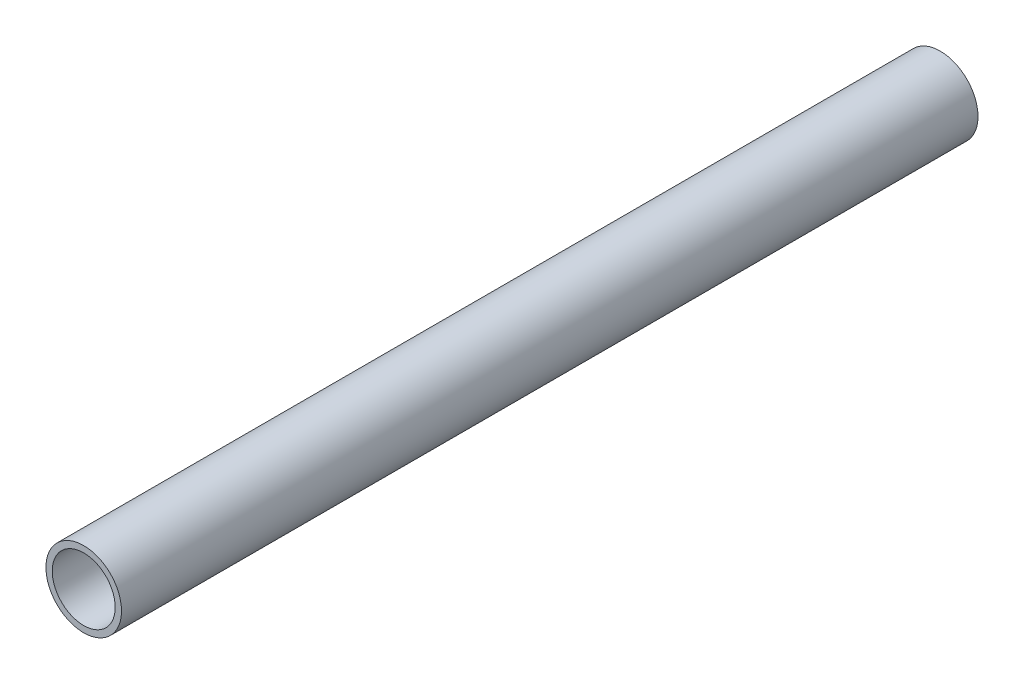
ISO-10303-21;
HEADER;
FILE_DESCRIPTION(('STEP AP214'),'2;1');
FILE_NAME('part.step','',(''),(''),'','','');
FILE_SCHEMA(('AUTOMOTIVE_DESIGN { 1 0 10303 214 1 1 1 1 }'));
ENDSEC;
DATA;
#1=APPLICATION_CONTEXT('core data for automotive mechanical design processes');
#2=APPLICATION_PROTOCOL_DEFINITION('international standard','automotive_design',2000,#1);
#3=PRODUCT_CONTEXT('',#1,'mechanical');
#4=PRODUCT('Part','Part','',(#3));
#5=PRODUCT_RELATED_PRODUCT_CATEGORY('part','',(#4));
#6=PRODUCT_DEFINITION_FORMATION('','',#4);
#7=PRODUCT_DEFINITION_CONTEXT('part definition',#1,'design');
#8=PRODUCT_DEFINITION('design','',#6,#7);
#9=PRODUCT_DEFINITION_SHAPE('','',#8);
#10=(LENGTH_UNIT() NAMED_UNIT(*) SI_UNIT(.MILLI.,.METRE.));
#11=(NAMED_UNIT(*) PLANE_ANGLE_UNIT() SI_UNIT($,.RADIAN.));
#12=(NAMED_UNIT(*) SI_UNIT($,.STERADIAN.) SOLID_ANGLE_UNIT());
#13=UNCERTAINTY_MEASURE_WITH_UNIT(LENGTH_MEASURE(1.E-05),#10,'distance_accuracy_value','');
#14=(GEOMETRIC_REPRESENTATION_CONTEXT(3) GLOBAL_UNCERTAINTY_ASSIGNED_CONTEXT((#13)) GLOBAL_UNIT_ASSIGNED_CONTEXT((#10,
#11,#12)) REPRESENTATION_CONTEXT('',''));
#15=CARTESIAN_POINT('',(0.,0.,0.));
#16=DIRECTION('',(0.,0.,1.));
#17=DIRECTION('',(1.,0.,0.));
#18=AXIS2_PLACEMENT_3D('',#15,#16,#17);
#19=CARTESIAN_POINT('',(0.,0.,0.));
#20=DIRECTION('',(0.,0.,1.));
#21=DIRECTION('',(1.,0.,0.));
#22=AXIS2_PLACEMENT_3D('',#19,#20,#21);
#23=CYLINDRICAL_SURFACE('',#22,5.);
#24=CARTESIAN_POINT('',(0.,0.,136.));
#25=DIRECTION('',(0.,0.,1.));
#26=DIRECTION('',(1.,0.,0.));
#27=AXIS2_PLACEMENT_3D('',#24,#25,#26);
#28=CIRCLE('',#27,5.);
#29=CARTESIAN_POINT('',(5.,0.,136.));
#30=VERTEX_POINT('',#29);
#31=EDGE_CURVE('E18',#30,#30,#28,.T.);
#32=ORIENTED_EDGE('',*,*,#31,.T.);
#33=EDGE_LOOP('',(#32));
#34=FACE_BOUND('',#33,.T.);
#35=CARTESIAN_POINT('',(0.,0.,0.));
#36=DIRECTION('',(0.,0.,1.));
#37=DIRECTION('',(1.,0.,0.));
#38=AXIS2_PLACEMENT_3D('',#35,#36,#37);
#39=CIRCLE('',#38,5.);
#40=CARTESIAN_POINT('',(5.,0.,0.));
#41=VERTEX_POINT('',#40);
#42=EDGE_CURVE('E10',#41,#41,#39,.T.);
#43=ORIENTED_EDGE('',*,*,#42,.F.);
#44=EDGE_LOOP('',(#43));
#45=FACE_BOUND('',#44,.T.);
#46=ADVANCED_FACE('F15',(#34,#45),#23,.F.);
#47=CARTESIAN_POINT('',(0.,0.,0.));
#48=DIRECTION('',(0.,0.,1.));
#49=DIRECTION('',(1.,0.,0.));
#50=AXIS2_PLACEMENT_3D('',#47,#48,#49);
#51=PLANE('',#50);
#52=ORIENTED_EDGE('',*,*,#42,.T.);
#53=EDGE_LOOP('',(#52));
#54=FACE_BOUND('',#53,.T.);
#55=CARTESIAN_POINT('',(0.,0.,0.));
#56=DIRECTION('',(0.,0.,1.));
#57=DIRECTION('',(1.,0.,0.));
#58=AXIS2_PLACEMENT_3D('',#55,#56,#57);
#59=CIRCLE('',#58,6.);
#60=CARTESIAN_POINT('',(6.,0.,0.));
#61=VERTEX_POINT('',#60);
#62=EDGE_CURVE('E30',#61,#61,#59,.T.);
#63=ORIENTED_EDGE('',*,*,#62,.F.);
#64=EDGE_LOOP('',(#63));
#65=FACE_BOUND('',#64,.T.);
#66=ADVANCED_FACE('F48',(#54,#65),#51,.F.);
#67=CARTESIAN_POINT('',(0.,0.,136.));
#68=DIRECTION('',(0.,0.,1.));
#69=DIRECTION('',(1.,0.,0.));
#70=AXIS2_PLACEMENT_3D('',#67,#68,#69);
#71=PLANE('',#70);
#72=ORIENTED_EDGE('',*,*,#31,.F.);
#73=EDGE_LOOP('',(#72));
#74=FACE_BOUND('',#73,.T.);
#75=CARTESIAN_POINT('',(0.,0.,136.));
#76=DIRECTION('',(0.,0.,1.));
#77=DIRECTION('',(1.,0.,0.));
#78=AXIS2_PLACEMENT_3D('',#75,#76,#77);
#79=CIRCLE('',#78,6.);
#80=CARTESIAN_POINT('',(6.,0.,136.));
#81=VERTEX_POINT('',#80);
#82=EDGE_CURVE('E34',#81,#81,#79,.T.);
#83=ORIENTED_EDGE('',*,*,#82,.T.);
#84=EDGE_LOOP('',(#83));
#85=FACE_BOUND('',#84,.T.);
#86=ADVANCED_FACE('F40',(#74,#85),#71,.T.);
#87=CARTESIAN_POINT('',(0.,0.,0.));
#88=DIRECTION('',(0.,0.,1.));
#89=DIRECTION('',(1.,0.,0.));
#90=AXIS2_PLACEMENT_3D('',#87,#88,#89);
#91=CYLINDRICAL_SURFACE('',#90,6.);
#92=ORIENTED_EDGE('',*,*,#82,.F.);
#93=EDGE_LOOP('',(#92));
#94=FACE_BOUND('',#93,.T.);
#95=ORIENTED_EDGE('',*,*,#62,.T.);
#96=EDGE_LOOP('',(#95));
#97=FACE_BOUND('',#96,.T.);
#98=ADVANCED_FACE('F42',(#94,#97),#91,.T.);
#99=CLOSED_SHELL('',(#46,#66,#86,#98));
#100=MANIFOLD_SOLID_BREP('B1',#99);
#101=ADVANCED_BREP_SHAPE_REPRESENTATION('',(#18,#100),#14);
#102=SHAPE_DEFINITION_REPRESENTATION(#9,#101);
ENDSEC;
END-ISO-10303-21;
